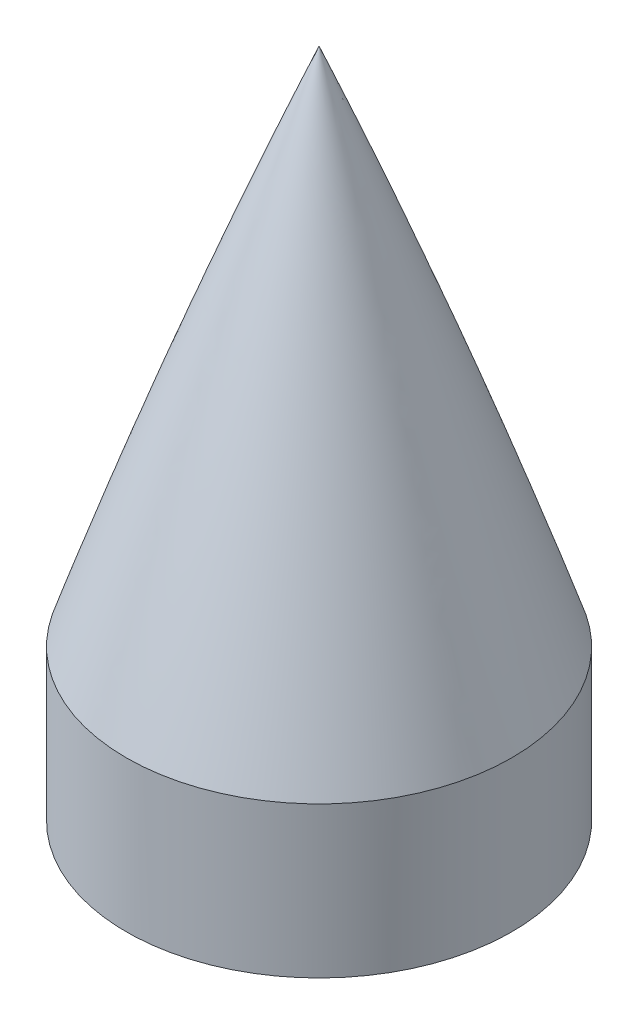
ISO-10303-21;
HEADER;
FILE_DESCRIPTION(('STEP AP214'),'2;1');
FILE_NAME('part.step','',(''),(''),'','','');
FILE_SCHEMA(('AUTOMOTIVE_DESIGN { 1 0 10303 214 1 1 1 1 }'));
ENDSEC;
DATA;
#1=APPLICATION_CONTEXT('core data for automotive mechanical design processes');
#2=APPLICATION_PROTOCOL_DEFINITION('international standard','automotive_design',2000,#1);
#3=PRODUCT_CONTEXT('',#1,'mechanical');
#4=PRODUCT('Part','Part','',(#3));
#5=PRODUCT_RELATED_PRODUCT_CATEGORY('part','',(#4));
#6=PRODUCT_DEFINITION_FORMATION('','',#4);
#7=PRODUCT_DEFINITION_CONTEXT('part definition',#1,'design');
#8=PRODUCT_DEFINITION('design','',#6,#7);
#9=PRODUCT_DEFINITION_SHAPE('','',#8);
#10=(LENGTH_UNIT() NAMED_UNIT(*) SI_UNIT(.MILLI.,.METRE.));
#11=(NAMED_UNIT(*) PLANE_ANGLE_UNIT() SI_UNIT($,.RADIAN.));
#12=(NAMED_UNIT(*) SI_UNIT($,.STERADIAN.) SOLID_ANGLE_UNIT());
#13=UNCERTAINTY_MEASURE_WITH_UNIT(LENGTH_MEASURE(1.E-05),#10,'distance_accuracy_value','');
#14=(GEOMETRIC_REPRESENTATION_CONTEXT(3) GLOBAL_UNCERTAINTY_ASSIGNED_CONTEXT((#13)) GLOBAL_UNIT_ASSIGNED_CONTEXT((#10,
#11,#12)) REPRESENTATION_CONTEXT('',''));
#15=CARTESIAN_POINT('',(0.,0.,0.));
#16=DIRECTION('',(0.,0.,1.));
#17=DIRECTION('',(1.,0.,0.));
#18=AXIS2_PLACEMENT_3D('',#15,#16,#17);
#19=CARTESIAN_POINT('',(0.,-1.11022302462516E-13,-964.039392901324));
#20=DIRECTION('',(-1.,0.,0.));
#21=DIRECTION('',(0.,0.,1.));
#22=AXIS2_PLACEMENT_3D('',#19,#20,#21);
#23=CIRCLE('',#22,1039.38939290132);
#24=TRIMMED_CURVE('',#23,(PARAMETER_VALUE(-0.383112862193113)),
(PARAMETER_VALUE(0.383112862193113)),.T.,.PARAMETER.);
#25=CARTESIAN_POINT('',(0.,-1.11022302462516E-13,0.));
#26=DIRECTION('',(0.,1.,0.));
#27=AXIS1_PLACEMENT('',#25,#26);
#28=SURFACE_OF_REVOLUTION('',#24,#27);
#29=CARTESIAN_POINT('',(0.,327.489212170568,0.));
#30=DIRECTION('',(0.,1.,0.));
#31=DIRECTION('',(0.,0.,1.));
#32=AXIS2_PLACEMENT_3D('',#29,#30,#31);
#33=CIRCLE('',#32,22.4093518328785);
#34=CARTESIAN_POINT('',(0.,327.489212170568,22.4093518328785));
#35=VERTEX_POINT('',#34);
#36=EDGE_CURVE('E12',#35,#35,#33,.T.);
#37=ORIENTED_EDGE('',*,*,#36,.F.);
#38=EDGE_LOOP('',(#37));
#39=FACE_BOUND('',#38,.T.);
#40=CARTESIAN_POINT('',(0.,388.533600876719,0.));
#41=VERTEX_POINT('',#40);
#42=VERTEX_LOOP('',#41);
#43=FACE_BOUND('',#42,.T.);
#44=ADVANCED_FACE('F40',(#39,#43),#28,.F.);
#45=CARTESIAN_POINT('',(0.,307.489212170568,0.));
#46=DIRECTION('',(0.,-1.,0.));
#47=DIRECTION('',(0.,0.,-1.));
#48=AXIS2_PLACEMENT_3D('',#45,#46,#47);
#49=PLANE('',#48);
#50=CARTESIAN_POINT('',(0.,307.489212170568,0.));
#51=DIRECTION('',(0.,-1.,0.));
#52=DIRECTION('',(0.,0.,-1.));
#53=AXIS2_PLACEMENT_3D('',#50,#51,#52);
#54=CIRCLE('',#53,25.5698544004034);
#55=CARTESIAN_POINT('',(0.,307.489212170568,-25.5698544004034));
#56=VERTEX_POINT('',#55);
#57=EDGE_CURVE('E49',#56,#56,#54,.T.);
#58=ORIENTED_EDGE('',*,*,#57,.T.);
#59=EDGE_LOOP('',(#58));
#60=FACE_BOUND('',#59,.T.);
#61=CARTESIAN_POINT('',(0.,307.489212170568,0.));
#62=DIRECTION('',(0.,-1.,0.));
#63=DIRECTION('',(0.,0.,-1.));
#64=AXIS2_PLACEMENT_3D('',#61,#62,#63);
#65=CIRCLE('',#64,22.4093518328785);
#66=CARTESIAN_POINT('',(0.,307.489212170568,-22.4093518328785));
#67=VERTEX_POINT('',#66);
#68=EDGE_CURVE('E80',#67,#67,#65,.T.);
#69=ORIENTED_EDGE('',*,*,#68,.F.);
#70=EDGE_LOOP('',(#69));
#71=FACE_BOUND('',#70,.T.);
#72=ADVANCED_FACE('F56',(#60,#71),#49,.T.);
#73=CARTESIAN_POINT('',(0.,307.489212170568,0.));
#74=DIRECTION('',(0.,1.,0.));
#75=DIRECTION('',(0.,0.,1.));
#76=AXIS2_PLACEMENT_3D('',#73,#74,#75);
#77=CYLINDRICAL_SURFACE('',#76,25.5698544004034);
#78=ORIENTED_EDGE('',*,*,#57,.F.);
#79=EDGE_LOOP('',(#78));
#80=FACE_BOUND('',#79,.T.);
#81=CARTESIAN_POINT('',(0.,327.489212170568,0.));
#82=DIRECTION('',(0.,-1.,0.));
#83=DIRECTION('',(0.,0.,-1.));
#84=AXIS2_PLACEMENT_3D('',#81,#82,#83);
#85=CIRCLE('',#84,25.5698544004034);
#86=CARTESIAN_POINT('',(0.,327.489212170568,-25.5698544004034));
#87=VERTEX_POINT('',#86);
#88=EDGE_CURVE('E83',#87,#87,#85,.T.);
#89=ORIENTED_EDGE('',*,*,#88,.T.);
#90=EDGE_LOOP('',(#89));
#91=FACE_BOUND('',#90,.T.);
#92=ADVANCED_FACE('F63',(#80,#91),#77,.T.);
#93=CARTESIAN_POINT('',(0.,307.489212170568,0.));
#94=DIRECTION('',(0.,1.,0.));
#95=DIRECTION('',(0.,0.,1.));
#96=AXIS2_PLACEMENT_3D('',#93,#94,#95);
#97=CYLINDRICAL_SURFACE('',#96,22.4093518328785);
#98=ORIENTED_EDGE('',*,*,#68,.T.);
#99=EDGE_LOOP('',(#98));
#100=FACE_BOUND('',#99,.T.);
#101=ORIENTED_EDGE('',*,*,#36,.T.);
#102=EDGE_LOOP('',(#101));
#103=FACE_BOUND('',#102,.T.);
#104=ADVANCED_FACE('F69',(#100,#103),#97,.F.);
#105=CARTESIAN_POINT('',(0.,-1.11022302462516E-13,-964.039392901324));
#106=DIRECTION('',(-1.,0.,0.));
#107=DIRECTION('',(0.,0.,1.));
#108=AXIS2_PLACEMENT_3D('',#105,#106,#107);
#109=CIRCLE('',#108,1042.38939290132);
#110=TRIMMED_CURVE('',#109,(PARAMETER_VALUE(-0.390191728322816)),
(PARAMETER_VALUE(0.390191728322816)),.T.,.PARAMETER.);
#111=CARTESIAN_POINT('',(0.,-1.11022302462516E-13,0.));
#112=DIRECTION('',(0.,1.,0.));
#113=AXIS1_PLACEMENT('',#111,#112);
#114=SURFACE_OF_REVOLUTION('',#110,#113);
#115=ORIENTED_EDGE('',*,*,#88,.F.);
#116=EDGE_LOOP('',(#115));
#117=FACE_BOUND('',#116,.T.);
#118=CARTESIAN_POINT('',(-1.11022302462516E-13,396.489212170568,0.));
#119=VERTEX_POINT('',#118);
#120=VERTEX_LOOP('',#119);
#121=FACE_BOUND('',#120,.T.);
#122=ADVANCED_FACE('F42',(#117,#121),#114,.T.);
#123=CLOSED_SHELL('',(#44,#72,#92,#104,#122));
#124=MANIFOLD_SOLID_BREP('B2',#123);
#125=ADVANCED_BREP_SHAPE_REPRESENTATION('',(#18,#124),#14);
#126=SHAPE_DEFINITION_REPRESENTATION(#9,#125);
ENDSEC;
END-ISO-10303-21;
